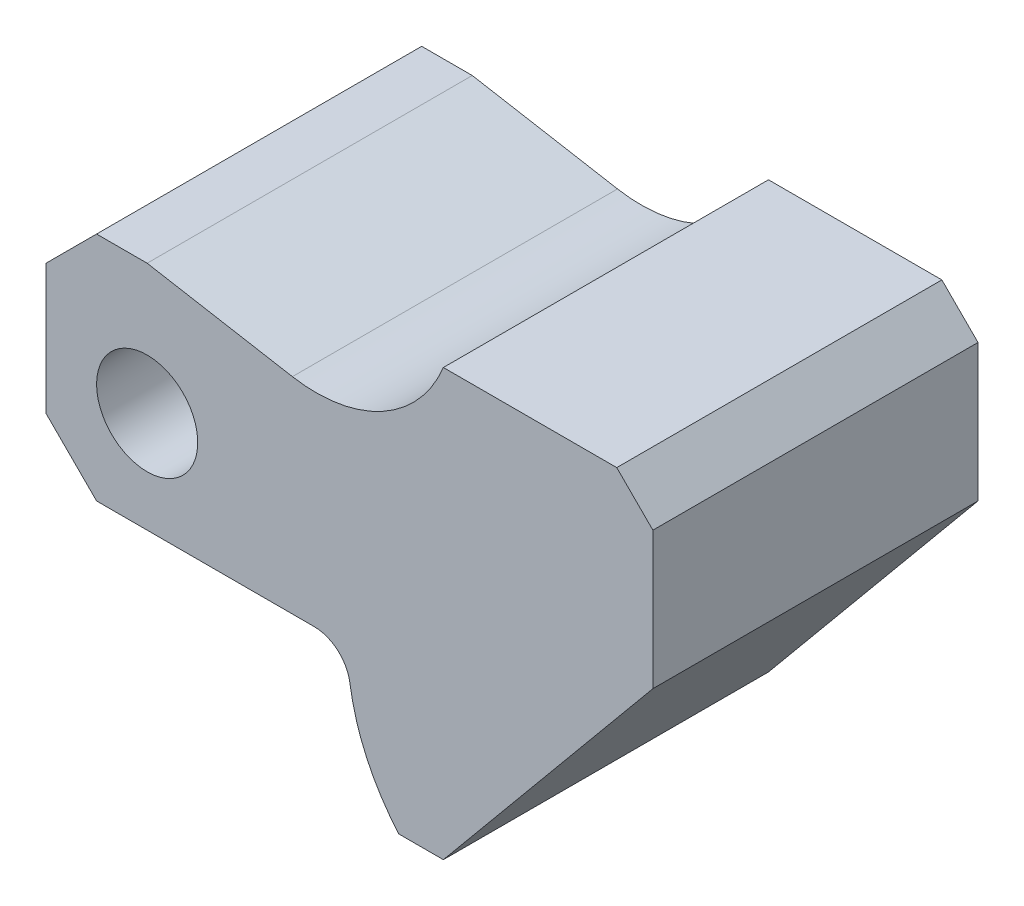
ISO-10303-21;
HEADER;
FILE_DESCRIPTION(('STEP AP214'),'2;1');
FILE_NAME('part.step','',(''),(''),'','','');
FILE_SCHEMA(('AUTOMOTIVE_DESIGN { 1 0 10303 214 1 1 1 1 }'));
ENDSEC;
DATA;
#1=APPLICATION_CONTEXT('core data for automotive mechanical design processes');
#2=APPLICATION_PROTOCOL_DEFINITION('international standard','automotive_design',2000,#1);
#3=PRODUCT_CONTEXT('',#1,'mechanical');
#4=PRODUCT('Part','Part','',(#3));
#5=PRODUCT_RELATED_PRODUCT_CATEGORY('part','',(#4));
#6=PRODUCT_DEFINITION_FORMATION('','',#4);
#7=PRODUCT_DEFINITION_CONTEXT('part definition',#1,'design');
#8=PRODUCT_DEFINITION('design','',#6,#7);
#9=PRODUCT_DEFINITION_SHAPE('','',#8);
#10=(LENGTH_UNIT() NAMED_UNIT(*) SI_UNIT(.MILLI.,.METRE.));
#11=(NAMED_UNIT(*) PLANE_ANGLE_UNIT() SI_UNIT($,.RADIAN.));
#12=(NAMED_UNIT(*) SI_UNIT($,.STERADIAN.) SOLID_ANGLE_UNIT());
#13=UNCERTAINTY_MEASURE_WITH_UNIT(LENGTH_MEASURE(1.E-05),#10,'distance_accuracy_value','');
#14=(GEOMETRIC_REPRESENTATION_CONTEXT(3) GLOBAL_UNCERTAINTY_ASSIGNED_CONTEXT((#13)) GLOBAL_UNIT_ASSIGNED_CONTEXT((#10,
#11,#12)) REPRESENTATION_CONTEXT('',''));
#15=CARTESIAN_POINT('',(0.,0.,0.));
#16=DIRECTION('',(0.,0.,1.));
#17=DIRECTION('',(1.,0.,0.));
#18=AXIS2_PLACEMENT_3D('',#15,#16,#17);
#19=CARTESIAN_POINT('',(37.4033577276849,47.1664622192664,45.));
#20=DIRECTION('',(0.,0.,1.));
#21=DIRECTION('',(1.,0.,0.));
#22=AXIS2_PLACEMENT_3D('',#19,#20,#21);
#23=PLANE('',#22);
#24=DIRECTION('',(-0.984807753012208,0.173648177666931,0.));
#25=VECTOR('',#24,1.);
#26=CARTESIAN_POINT('',(14.,32.,45.));
#27=LINE('',#26,#25);
#28=CARTESIAN_POINT('',(34.1040423520132,28.4551149120344,45.));
#29=VERTEX_POINT('',#28);
#30=CARTESIAN_POINT('',(14.,32.,45.));
#31=VERTEX_POINT('',#30);
#32=EDGE_CURVE('E201',#29,#31,#27,.T.);
#33=ORIENTED_EDGE('',*,*,#32,.T.);
#34=DIRECTION('',(-1.,0.,0.));
#35=VECTOR('',#34,1.);
#36=CARTESIAN_POINT('',(7.,32.,45.));
#37=LINE('',#36,#35);
#38=CARTESIAN_POINT('',(7.,32.,45.));
#39=VERTEX_POINT('',#38);
#40=EDGE_CURVE('E119',#31,#39,#37,.T.);
#41=ORIENTED_EDGE('',*,*,#40,.T.);
#42=DIRECTION('',(-0.707106781186548,-0.707106781186547,0.));
#43=VECTOR('',#42,1.);
#44=CARTESIAN_POINT('',(0.,25.,45.));
#45=LINE('',#44,#43);
#46=CARTESIAN_POINT('',(0.,25.,45.));
#47=VERTEX_POINT('',#46);
#48=EDGE_CURVE('E234',#39,#47,#45,.T.);
#49=ORIENTED_EDGE('',*,*,#48,.T.);
#50=DIRECTION('',(0.,-1.,0.));
#51=VECTOR('',#50,1.);
#52=CARTESIAN_POINT('',(0.,7.,45.));
#53=LINE('',#52,#51);
#54=CARTESIAN_POINT('',(0.,7.,45.));
#55=VERTEX_POINT('',#54);
#56=EDGE_CURVE('E253',#47,#55,#53,.T.);
#57=ORIENTED_EDGE('',*,*,#56,.T.);
#58=DIRECTION('',(0.707106781186547,-0.707106781186547,0.));
#59=VECTOR('',#58,1.);
#60=CARTESIAN_POINT('',(7.,0.,45.));
#61=LINE('',#60,#59);
#62=CARTESIAN_POINT('',(7.,0.,45.));
#63=VERTEX_POINT('',#62);
#64=EDGE_CURVE('E250',#55,#63,#61,.T.);
#65=ORIENTED_EDGE('',*,*,#64,.T.);
#66=DIRECTION('',(1.,0.,0.));
#67=VECTOR('',#66,1.);
#68=CARTESIAN_POINT('',(37.1125137012567,0.,45.));
#69=LINE('',#68,#67);
#70=CARTESIAN_POINT('',(37.1125137012567,0.,45.));
#71=VERTEX_POINT('',#70);
#72=EDGE_CURVE('E252',#63,#71,#69,.T.);
#73=ORIENTED_EDGE('',*,*,#72,.T.);
#74=CARTESIAN_POINT('',(37.1125137012567,-5.,45.));
#75=DIRECTION('',(0.,0.,-1.));
#76=DIRECTION('',(-1.,0.,0.));
#77=AXIS2_PLACEMENT_3D('',#74,#75,#76);
#78=CIRCLE('',#77,5.);
#79=CARTESIAN_POINT('',(42.0581524426685,-4.26470588235294,45.));
#80=VERTEX_POINT('',#79);
#81=EDGE_CURVE('E255',#71,#80,#78,.T.);
#82=ORIENTED_EDGE('',*,*,#81,.T.);
#83=CARTESIAN_POINT('',(70.7428571428571,0.,45.));
#84=DIRECTION('',(0.,0.,1.));
#85=DIRECTION('',(1.,0.,0.));
#86=AXIS2_PLACEMENT_3D('',#83,#84,#85);
#87=CIRCLE('',#86,29.);
#88=CARTESIAN_POINT('',(48.8339548426505,-19.,45.));
#89=VERTEX_POINT('',#88);
#90=EDGE_CURVE('E261',#80,#89,#87,.T.);
#91=ORIENTED_EDGE('',*,*,#90,.T.);
#92=DIRECTION('',(1.,0.,0.));
#93=VECTOR('',#92,1.);
#94=CARTESIAN_POINT('',(55.,-19.,45.));
#95=LINE('',#94,#93);
#96=CARTESIAN_POINT('',(55.,-19.,45.));
#97=VERTEX_POINT('',#96);
#98=EDGE_CURVE('E263',#89,#97,#95,.T.);
#99=ORIENTED_EDGE('',*,*,#98,.T.);
#100=DIRECTION('',(0.638017864750323,0.770021560905562,0.));
#101=VECTOR('',#100,1.);
#102=CARTESIAN_POINT('',(84.,16.,45.));
#103=LINE('',#102,#101);
#104=CARTESIAN_POINT('',(84.,16.,45.));
#105=VERTEX_POINT('',#104);
#106=EDGE_CURVE('E265',#97,#105,#103,.T.);
#107=ORIENTED_EDGE('',*,*,#106,.T.);
#108=DIRECTION('',(0.,1.,0.));
#109=VECTOR('',#108,1.);
#110=CARTESIAN_POINT('',(84.,35.,45.));
#111=LINE('',#110,#109);
#112=CARTESIAN_POINT('',(84.,35.,45.));
#113=VERTEX_POINT('',#112);
#114=EDGE_CURVE('E156',#105,#113,#111,.T.);
#115=ORIENTED_EDGE('',*,*,#114,.T.);
#116=DIRECTION('',(-0.707106781186547,0.707106781186547,0.));
#117=VECTOR('',#116,1.);
#118=CARTESIAN_POINT('',(79.,40.,45.));
#119=LINE('',#118,#117);
#120=CARTESIAN_POINT('',(79.,40.,45.));
#121=VERTEX_POINT('',#120);
#122=EDGE_CURVE('E150',#113,#121,#119,.T.);
#123=ORIENTED_EDGE('',*,*,#122,.T.);
#124=DIRECTION('',(-1.,0.,0.));
#125=VECTOR('',#124,1.);
#126=CARTESIAN_POINT('',(55.,40.,45.));
#127=LINE('',#126,#125);
#128=CARTESIAN_POINT('',(55.,40.,45.));
#129=VERTEX_POINT('',#128);
#130=EDGE_CURVE('E154',#121,#129,#127,.T.);
#131=ORIENTED_EDGE('',*,*,#130,.T.);
#132=CARTESIAN_POINT('',(37.4033577276849,47.1664622192664,45.));
#133=DIRECTION('',(0.,0.,-1.));
#134=DIRECTION('',(1.,0.,0.));
#135=AXIS2_PLACEMENT_3D('',#132,#133,#134);
#136=CIRCLE('',#135,19.);
#137=EDGE_CURVE('E58',#129,#29,#136,.T.);
#138=ORIENTED_EDGE('',*,*,#137,.T.);
#139=EDGE_LOOP('',(#33,#41,#49,#57,#65,#73,#82,#91,#99,#107,#115,#123,#131,#138));
#140=FACE_BOUND('',#139,.T.);
#141=CARTESIAN_POINT('',(14.,14.,45.));
#142=DIRECTION('',(0.,0.,1.));
#143=DIRECTION('',(1.,0.,0.));
#144=AXIS2_PLACEMENT_3D('',#141,#142,#143);
#145=CIRCLE('',#144,7.);
#146=CARTESIAN_POINT('',(7.,14.,45.));
#147=VERTEX_POINT('',#146);
#148=EDGE_CURVE('E178',#147,#147,#145,.T.);
#149=ORIENTED_EDGE('',*,*,#148,.F.);
#150=EDGE_LOOP('',(#149));
#151=FACE_BOUND('',#150,.T.);
#152=ADVANCED_FACE('F41',(#140,#151),#23,.T.);
#153=CARTESIAN_POINT('',(37.4033577276849,47.1664622192664,0.));
#154=DIRECTION('',(0.,0.,1.));
#155=DIRECTION('',(1.,0.,0.));
#156=AXIS2_PLACEMENT_3D('',#153,#154,#155);
#157=PLANE('',#156);
#158=DIRECTION('',(-0.984807753012208,0.173648177666931,0.));
#159=VECTOR('',#158,1.);
#160=CARTESIAN_POINT('',(14.,32.,0.));
#161=LINE('',#160,#159);
#162=CARTESIAN_POINT('',(34.1040423520132,28.4551149120344,0.));
#163=VERTEX_POINT('',#162);
#164=CARTESIAN_POINT('',(14.,32.,0.));
#165=VERTEX_POINT('',#164);
#166=EDGE_CURVE('E174',#163,#165,#161,.T.);
#167=ORIENTED_EDGE('',*,*,#166,.F.);
#168=CARTESIAN_POINT('',(37.4033577276849,47.1664622192664,0.));
#169=DIRECTION('',(0.,0.,-1.));
#170=DIRECTION('',(1.,0.,0.));
#171=AXIS2_PLACEMENT_3D('',#168,#169,#170);
#172=CIRCLE('',#171,19.);
#173=CARTESIAN_POINT('',(55.,40.,0.));
#174=VERTEX_POINT('',#173);
#175=EDGE_CURVE('E111',#174,#163,#172,.T.);
#176=ORIENTED_EDGE('',*,*,#175,.F.);
#177=DIRECTION('',(-1.,0.,0.));
#178=VECTOR('',#177,1.);
#179=CARTESIAN_POINT('',(55.,40.,0.));
#180=LINE('',#179,#178);
#181=CARTESIAN_POINT('',(79.,40.,0.));
#182=VERTEX_POINT('',#181);
#183=EDGE_CURVE('E105',#182,#174,#180,.T.);
#184=ORIENTED_EDGE('',*,*,#183,.F.);
#185=DIRECTION('',(-0.707106781186547,0.707106781186547,0.));
#186=VECTOR('',#185,1.);
#187=CARTESIAN_POINT('',(79.,40.,0.));
#188=LINE('',#187,#186);
#189=CARTESIAN_POINT('',(84.,35.,0.));
#190=VERTEX_POINT('',#189);
#191=EDGE_CURVE('E164',#190,#182,#188,.T.);
#192=ORIENTED_EDGE('',*,*,#191,.F.);
#193=DIRECTION('',(0.,1.,0.));
#194=VECTOR('',#193,1.);
#195=CARTESIAN_POINT('',(84.,35.,0.));
#196=LINE('',#195,#194);
#197=CARTESIAN_POINT('',(84.,16.,0.));
#198=VERTEX_POINT('',#197);
#199=EDGE_CURVE('E196',#198,#190,#196,.T.);
#200=ORIENTED_EDGE('',*,*,#199,.F.);
#201=DIRECTION('',(0.638017864750323,0.770021560905562,0.));
#202=VECTOR('',#201,1.);
#203=CARTESIAN_POINT('',(84.,16.,0.));
#204=LINE('',#203,#202);
#205=CARTESIAN_POINT('',(55.,-19.,0.));
#206=VERTEX_POINT('',#205);
#207=EDGE_CURVE('E194',#206,#198,#204,.T.);
#208=ORIENTED_EDGE('',*,*,#207,.F.);
#209=DIRECTION('',(1.,0.,0.));
#210=VECTOR('',#209,1.);
#211=CARTESIAN_POINT('',(55.,-19.,0.));
#212=LINE('',#211,#210);
#213=CARTESIAN_POINT('',(48.8339548426505,-19.,0.));
#214=VERTEX_POINT('',#213);
#215=EDGE_CURVE('E192',#214,#206,#212,.T.);
#216=ORIENTED_EDGE('',*,*,#215,.F.);
#217=CARTESIAN_POINT('',(70.7428571428571,0.,0.));
#218=DIRECTION('',(0.,0.,1.));
#219=DIRECTION('',(1.,0.,0.));
#220=AXIS2_PLACEMENT_3D('',#217,#218,#219);
#221=CIRCLE('',#220,29.);
#222=CARTESIAN_POINT('',(42.0581524426685,-4.26470588235294,0.));
#223=VERTEX_POINT('',#222);
#224=EDGE_CURVE('E190',#223,#214,#221,.T.);
#225=ORIENTED_EDGE('',*,*,#224,.F.);
#226=CARTESIAN_POINT('',(37.1125137012567,-5.,0.));
#227=DIRECTION('',(0.,0.,-1.));
#228=DIRECTION('',(-1.,0.,0.));
#229=AXIS2_PLACEMENT_3D('',#226,#227,#228);
#230=CIRCLE('',#229,5.);
#231=CARTESIAN_POINT('',(37.1125137012567,0.,0.));
#232=VERTEX_POINT('',#231);
#233=EDGE_CURVE('E188',#232,#223,#230,.T.);
#234=ORIENTED_EDGE('',*,*,#233,.F.);
#235=DIRECTION('',(1.,0.,0.));
#236=VECTOR('',#235,1.);
#237=CARTESIAN_POINT('',(37.1125137012567,0.,0.));
#238=LINE('',#237,#236);
#239=CARTESIAN_POINT('',(7.,0.,0.));
#240=VERTEX_POINT('',#239);
#241=EDGE_CURVE('E186',#240,#232,#238,.T.);
#242=ORIENTED_EDGE('',*,*,#241,.F.);
#243=DIRECTION('',(0.707106781186547,-0.707106781186547,0.));
#244=VECTOR('',#243,1.);
#245=CARTESIAN_POINT('',(7.,0.,0.));
#246=LINE('',#245,#244);
#247=CARTESIAN_POINT('',(0.,7.,0.));
#248=VERTEX_POINT('',#247);
#249=EDGE_CURVE('E184',#248,#240,#246,.T.);
#250=ORIENTED_EDGE('',*,*,#249,.F.);
#251=DIRECTION('',(0.,-1.,0.));
#252=VECTOR('',#251,1.);
#253=CARTESIAN_POINT('',(0.,7.,0.));
#254=LINE('',#253,#252);
#255=CARTESIAN_POINT('',(0.,25.,0.));
#256=VERTEX_POINT('',#255);
#257=EDGE_CURVE('E182',#256,#248,#254,.T.);
#258=ORIENTED_EDGE('',*,*,#257,.F.);
#259=DIRECTION('',(-0.707106781186548,-0.707106781186547,0.));
#260=VECTOR('',#259,1.);
#261=CARTESIAN_POINT('',(0.,25.,0.));
#262=LINE('',#261,#260);
#263=CARTESIAN_POINT('',(7.,32.,0.));
#264=VERTEX_POINT('',#263);
#265=EDGE_CURVE('E180',#264,#256,#262,.T.);
#266=ORIENTED_EDGE('',*,*,#265,.F.);
#267=DIRECTION('',(-1.,0.,0.));
#268=VECTOR('',#267,1.);
#269=CARTESIAN_POINT('',(7.,32.,0.));
#270=LINE('',#269,#268);
#271=EDGE_CURVE('E177',#165,#264,#270,.T.);
#272=ORIENTED_EDGE('',*,*,#271,.F.);
#273=EDGE_LOOP('',(#167,#176,#184,#192,#200,#208,#216,#225,#234,#242,#250,#258,#266,#272));
#274=FACE_BOUND('',#273,.T.);
#275=CARTESIAN_POINT('',(14.,14.,0.));
#276=DIRECTION('',(0.,0.,1.));
#277=DIRECTION('',(1.,0.,0.));
#278=AXIS2_PLACEMENT_3D('',#275,#276,#277);
#279=CIRCLE('',#278,7.);
#280=CARTESIAN_POINT('',(7.,14.,0.));
#281=VERTEX_POINT('',#280);
#282=EDGE_CURVE('E506',#281,#281,#279,.T.);
#283=ORIENTED_EDGE('',*,*,#282,.T.);
#284=EDGE_LOOP('',(#283));
#285=FACE_BOUND('',#284,.T.);
#286=ADVANCED_FACE('F238',(#274,#285),#157,.F.);
#287=CARTESIAN_POINT('',(14.,32.,45.));
#288=DIRECTION('',(-0.173648177666931,-0.984807753012208,0.));
#289=DIRECTION('',(0.984807753012208,-0.173648177666931,0.));
#290=AXIS2_PLACEMENT_3D('',#287,#288,#289);
#291=PLANE('',#290);
#292=ORIENTED_EDGE('',*,*,#166,.T.);
#293=DIRECTION('',(0.,0.,-1.));
#294=VECTOR('',#293,1.);
#295=CARTESIAN_POINT('',(14.,32.,45.));
#296=LINE('',#295,#294);
#297=EDGE_CURVE('E11',#31,#165,#296,.T.);
#298=ORIENTED_EDGE('',*,*,#297,.F.);
#299=ORIENTED_EDGE('',*,*,#32,.F.);
#300=DIRECTION('',(0.,0.,-1.));
#301=VECTOR('',#300,1.);
#302=CARTESIAN_POINT('',(34.1040423520132,28.4551149120344,45.));
#303=LINE('',#302,#301);
#304=EDGE_CURVE('E170',#29,#163,#303,.T.);
#305=ORIENTED_EDGE('',*,*,#304,.T.);
#306=EDGE_LOOP('',(#292,#298,#299,#305));
#307=FACE_BOUND('',#306,.T.);
#308=ADVANCED_FACE('F43',(#307),#291,.F.);
#309=CARTESIAN_POINT('',(7.,32.,45.));
#310=DIRECTION('',(0.,-1.,0.));
#311=DIRECTION('',(0.,0.,-1.));
#312=AXIS2_PLACEMENT_3D('',#309,#310,#311);
#313=PLANE('',#312);
#314=ORIENTED_EDGE('',*,*,#271,.T.);
#315=DIRECTION('',(0.,0.,-1.));
#316=VECTOR('',#315,1.);
#317=CARTESIAN_POINT('',(7.,32.,45.));
#318=LINE('',#317,#316);
#319=EDGE_CURVE('E50',#39,#264,#318,.T.);
#320=ORIENTED_EDGE('',*,*,#319,.F.);
#321=ORIENTED_EDGE('',*,*,#40,.F.);
#322=ORIENTED_EDGE('',*,*,#297,.T.);
#323=EDGE_LOOP('',(#314,#320,#321,#322));
#324=FACE_BOUND('',#323,.T.);
#325=ADVANCED_FACE('F299',(#324),#313,.F.);
#326=CARTESIAN_POINT('',(0.,25.,45.));
#327=DIRECTION('',(0.707106781186547,-0.707106781186547,0.));
#328=DIRECTION('',(0.707106781186548,0.707106781186548,0.));
#329=AXIS2_PLACEMENT_3D('',#326,#327,#328);
#330=PLANE('',#329);
#331=ORIENTED_EDGE('',*,*,#265,.T.);
#332=DIRECTION('',(0.,0.,-1.));
#333=VECTOR('',#332,1.);
#334=CARTESIAN_POINT('',(0.,25.,45.));
#335=LINE('',#334,#333);
#336=EDGE_CURVE('E226',#47,#256,#335,.T.);
#337=ORIENTED_EDGE('',*,*,#336,.F.);
#338=ORIENTED_EDGE('',*,*,#48,.F.);
#339=ORIENTED_EDGE('',*,*,#319,.T.);
#340=EDGE_LOOP('',(#331,#337,#338,#339));
#341=FACE_BOUND('',#340,.T.);
#342=ADVANCED_FACE('F232',(#341),#330,.F.);
#343=CARTESIAN_POINT('',(0.,7.,45.));
#344=DIRECTION('',(1.,0.,0.));
#345=DIRECTION('',(0.,0.,-1.));
#346=AXIS2_PLACEMENT_3D('',#343,#344,#345);
#347=PLANE('',#346);
#348=ORIENTED_EDGE('',*,*,#257,.T.);
#349=DIRECTION('',(0.,0.,-1.));
#350=VECTOR('',#349,1.);
#351=CARTESIAN_POINT('',(0.,7.,45.));
#352=LINE('',#351,#350);
#353=EDGE_CURVE('E223',#55,#248,#352,.T.);
#354=ORIENTED_EDGE('',*,*,#353,.F.);
#355=ORIENTED_EDGE('',*,*,#56,.F.);
#356=ORIENTED_EDGE('',*,*,#336,.T.);
#357=EDGE_LOOP('',(#348,#354,#355,#356));
#358=FACE_BOUND('',#357,.T.);
#359=ADVANCED_FACE('F244',(#358),#347,.F.);
#360=CARTESIAN_POINT('',(7.,0.,45.));
#361=DIRECTION('',(0.707106781186547,0.707106781186547,0.));
#362=DIRECTION('',(-0.707106781186548,0.707106781186548,0.));
#363=AXIS2_PLACEMENT_3D('',#360,#361,#362);
#364=PLANE('',#363);
#365=ORIENTED_EDGE('',*,*,#249,.T.);
#366=DIRECTION('',(0.,0.,-1.));
#367=VECTOR('',#366,1.);
#368=CARTESIAN_POINT('',(7.,0.,45.));
#369=LINE('',#368,#367);
#370=EDGE_CURVE('E220',#63,#240,#369,.T.);
#371=ORIENTED_EDGE('',*,*,#370,.F.);
#372=ORIENTED_EDGE('',*,*,#64,.F.);
#373=ORIENTED_EDGE('',*,*,#353,.T.);
#374=EDGE_LOOP('',(#365,#371,#372,#373));
#375=FACE_BOUND('',#374,.T.);
#376=ADVANCED_FACE('F248',(#375),#364,.F.);
#377=CARTESIAN_POINT('',(37.1125137012567,0.,45.));
#378=DIRECTION('',(0.,1.,0.));
#379=DIRECTION('',(0.,0.,1.));
#380=AXIS2_PLACEMENT_3D('',#377,#378,#379);
#381=PLANE('',#380);
#382=ORIENTED_EDGE('',*,*,#241,.T.);
#383=DIRECTION('',(0.,0.,-1.));
#384=VECTOR('',#383,1.);
#385=CARTESIAN_POINT('',(37.1125137012567,0.,45.));
#386=LINE('',#385,#384);
#387=EDGE_CURVE('E217',#71,#232,#386,.T.);
#388=ORIENTED_EDGE('',*,*,#387,.F.);
#389=ORIENTED_EDGE('',*,*,#72,.F.);
#390=ORIENTED_EDGE('',*,*,#370,.T.);
#391=EDGE_LOOP('',(#382,#388,#389,#390));
#392=FACE_BOUND('',#391,.T.);
#393=ADVANCED_FACE('F312',(#392),#381,.F.);
#394=CARTESIAN_POINT('',(37.1125137012567,-5.,45.));
#395=DIRECTION('',(0.,0.,-1.));
#396=DIRECTION('',(-1.,0.,0.));
#397=AXIS2_PLACEMENT_3D('',#394,#395,#396);
#398=CYLINDRICAL_SURFACE('',#397,5.);
#399=ORIENTED_EDGE('',*,*,#233,.T.);
#400=DIRECTION('',(0.,0.,-1.));
#401=VECTOR('',#400,1.);
#402=CARTESIAN_POINT('',(42.0581524426685,-4.26470588235294,45.));
#403=LINE('',#402,#401);
#404=EDGE_CURVE('E214',#80,#223,#403,.T.);
#405=ORIENTED_EDGE('',*,*,#404,.F.);
#406=ORIENTED_EDGE('',*,*,#81,.F.);
#407=ORIENTED_EDGE('',*,*,#387,.T.);
#408=EDGE_LOOP('',(#399,#405,#406,#407));
#409=FACE_BOUND('',#408,.T.);
#410=ADVANCED_FACE('F315',(#409),#398,.F.);
#411=CARTESIAN_POINT('',(70.7428571428571,0.,45.));
#412=DIRECTION('',(0.,0.,-1.));
#413=DIRECTION('',(-1.,0.,0.));
#414=AXIS2_PLACEMENT_3D('',#411,#412,#413);
#415=CYLINDRICAL_SURFACE('',#414,29.);
#416=ORIENTED_EDGE('',*,*,#224,.T.);
#417=DIRECTION('',(0.,0.,-1.));
#418=VECTOR('',#417,1.);
#419=CARTESIAN_POINT('',(48.8339548426505,-19.,45.));
#420=LINE('',#419,#418);
#421=EDGE_CURVE('E211',#89,#214,#420,.T.);
#422=ORIENTED_EDGE('',*,*,#421,.F.);
#423=ORIENTED_EDGE('',*,*,#90,.F.);
#424=ORIENTED_EDGE('',*,*,#404,.T.);
#425=EDGE_LOOP('',(#416,#422,#423,#424));
#426=FACE_BOUND('',#425,.T.);
#427=ADVANCED_FACE('F319',(#426),#415,.T.);
#428=CARTESIAN_POINT('',(55.,-19.,45.));
#429=DIRECTION('',(0.,1.,0.));
#430=DIRECTION('',(-1.,0.,0.));
#431=AXIS2_PLACEMENT_3D('',#428,#429,#430);
#432=PLANE('',#431);
#433=ORIENTED_EDGE('',*,*,#215,.T.);
#434=DIRECTION('',(0.,0.,-1.));
#435=VECTOR('',#434,1.);
#436=CARTESIAN_POINT('',(55.,-19.,45.));
#437=LINE('',#436,#435);
#438=EDGE_CURVE('E208',#97,#206,#437,.T.);
#439=ORIENTED_EDGE('',*,*,#438,.F.);
#440=ORIENTED_EDGE('',*,*,#98,.F.);
#441=ORIENTED_EDGE('',*,*,#421,.T.);
#442=EDGE_LOOP('',(#433,#439,#440,#441));
#443=FACE_BOUND('',#442,.T.);
#444=ADVANCED_FACE('F323',(#443),#432,.F.);
#445=CARTESIAN_POINT('',(84.,16.,45.));
#446=DIRECTION('',(-0.770021560905562,0.638017864750323,0.));
#447=DIRECTION('',(-0.638017864750323,-0.770021560905562,0.));
#448=AXIS2_PLACEMENT_3D('',#445,#446,#447);
#449=PLANE('',#448);
#450=ORIENTED_EDGE('',*,*,#207,.T.);
#451=DIRECTION('',(0.,0.,-1.));
#452=VECTOR('',#451,1.);
#453=CARTESIAN_POINT('',(84.,16.,45.));
#454=LINE('',#453,#452);
#455=EDGE_CURVE('E205',#105,#198,#454,.T.);
#456=ORIENTED_EDGE('',*,*,#455,.F.);
#457=ORIENTED_EDGE('',*,*,#106,.F.);
#458=ORIENTED_EDGE('',*,*,#438,.T.);
#459=EDGE_LOOP('',(#450,#456,#457,#458));
#460=FACE_BOUND('',#459,.T.);
#461=ADVANCED_FACE('F271',(#460),#449,.F.);
#462=CARTESIAN_POINT('',(84.,35.,45.));
#463=DIRECTION('',(-1.,0.,0.));
#464=DIRECTION('',(0.,0.,1.));
#465=AXIS2_PLACEMENT_3D('',#462,#463,#464);
#466=PLANE('',#465);
#467=ORIENTED_EDGE('',*,*,#199,.T.);
#468=DIRECTION('',(0.,0.,-1.));
#469=VECTOR('',#468,1.);
#470=CARTESIAN_POINT('',(84.,35.,45.));
#471=LINE('',#470,#469);
#472=EDGE_CURVE('E165',#113,#190,#471,.T.);
#473=ORIENTED_EDGE('',*,*,#472,.F.);
#474=ORIENTED_EDGE('',*,*,#114,.F.);
#475=ORIENTED_EDGE('',*,*,#455,.T.);
#476=EDGE_LOOP('',(#467,#473,#474,#475));
#477=FACE_BOUND('',#476,.T.);
#478=ADVANCED_FACE('F275',(#477),#466,.F.);
#479=CARTESIAN_POINT('',(79.,40.,45.));
#480=DIRECTION('',(-0.707106781186547,-0.707106781186547,0.));
#481=DIRECTION('',(0.707106781186548,-0.707106781186548,0.));
#482=AXIS2_PLACEMENT_3D('',#479,#480,#481);
#483=PLANE('',#482);
#484=ORIENTED_EDGE('',*,*,#191,.T.);
#485=DIRECTION('',(0.,0.,-1.));
#486=VECTOR('',#485,1.);
#487=CARTESIAN_POINT('',(79.,40.,45.));
#488=LINE('',#487,#486);
#489=EDGE_CURVE('E161',#121,#182,#488,.T.);
#490=ORIENTED_EDGE('',*,*,#489,.F.);
#491=ORIENTED_EDGE('',*,*,#122,.F.);
#492=ORIENTED_EDGE('',*,*,#472,.T.);
#493=EDGE_LOOP('',(#484,#490,#491,#492));
#494=FACE_BOUND('',#493,.T.);
#495=ADVANCED_FACE('F162',(#494),#483,.F.);
#496=CARTESIAN_POINT('',(55.,40.,45.));
#497=DIRECTION('',(0.,-1.,0.));
#498=DIRECTION('',(1.,0.,0.));
#499=AXIS2_PLACEMENT_3D('',#496,#497,#498);
#500=PLANE('',#499);
#501=ORIENTED_EDGE('',*,*,#183,.T.);
#502=DIRECTION('',(0.,0.,-1.));
#503=VECTOR('',#502,1.);
#504=CARTESIAN_POINT('',(55.,40.,45.));
#505=LINE('',#504,#503);
#506=EDGE_CURVE('E166',#129,#174,#505,.T.);
#507=ORIENTED_EDGE('',*,*,#506,.F.);
#508=ORIENTED_EDGE('',*,*,#130,.F.);
#509=ORIENTED_EDGE('',*,*,#489,.T.);
#510=EDGE_LOOP('',(#501,#507,#508,#509));
#511=FACE_BOUND('',#510,.T.);
#512=ADVANCED_FACE('F168',(#511),#500,.F.);
#513=CARTESIAN_POINT('',(37.4033577276849,47.1664622192664,45.));
#514=DIRECTION('',(0.,0.,-1.));
#515=DIRECTION('',(-1.,0.,0.));
#516=AXIS2_PLACEMENT_3D('',#513,#514,#515);
#517=CYLINDRICAL_SURFACE('',#516,19.);
#518=ORIENTED_EDGE('',*,*,#175,.T.);
#519=ORIENTED_EDGE('',*,*,#304,.F.);
#520=ORIENTED_EDGE('',*,*,#137,.F.);
#521=ORIENTED_EDGE('',*,*,#506,.T.);
#522=EDGE_LOOP('',(#518,#519,#520,#521));
#523=FACE_BOUND('',#522,.T.);
#524=ADVANCED_FACE('F279',(#523),#517,.F.);
#525=CARTESIAN_POINT('',(14.,14.,45.));
#526=DIRECTION('',(0.,0.,-1.));
#527=DIRECTION('',(-1.,0.,0.));
#528=AXIS2_PLACEMENT_3D('',#525,#526,#527);
#529=CYLINDRICAL_SURFACE('',#528,7.);
#530=CARTESIAN_POINT('',(7.,14.,45.));
#531=CARTESIAN_POINT('',(7.,14.,44.53125));
#532=CARTESIAN_POINT('',(7.,14.,44.0625));
#533=CARTESIAN_POINT('',(7.,14.,43.125));
#534=CARTESIAN_POINT('',(7.,14.,42.65625));
#535=CARTESIAN_POINT('',(7.,14.,41.71875));
#536=CARTESIAN_POINT('',(7.,14.,41.25));
#537=CARTESIAN_POINT('',(7.,14.,40.3125));
#538=CARTESIAN_POINT('',(7.,14.,39.84375));
#539=CARTESIAN_POINT('',(7.,14.,38.90625));
#540=CARTESIAN_POINT('',(7.,14.,38.4375));
#541=CARTESIAN_POINT('',(7.,14.,37.5));
#542=CARTESIAN_POINT('',(7.,14.,37.03125));
#543=CARTESIAN_POINT('',(7.,14.,36.09375));
#544=CARTESIAN_POINT('',(7.,14.,35.625));
#545=CARTESIAN_POINT('',(7.,14.,34.6875));
#546=CARTESIAN_POINT('',(7.,14.,34.21875));
#547=CARTESIAN_POINT('',(7.,14.,33.28125));
#548=CARTESIAN_POINT('',(7.,14.,32.8125));
#549=CARTESIAN_POINT('',(7.,14.,31.875));
#550=CARTESIAN_POINT('',(7.,14.,31.40625));
#551=CARTESIAN_POINT('',(7.,14.,30.46875));
#552=CARTESIAN_POINT('',(7.,14.,30.));
#553=CARTESIAN_POINT('',(7.,14.,29.0625));
#554=CARTESIAN_POINT('',(7.,14.,28.59375));
#555=CARTESIAN_POINT('',(7.,14.,27.65625));
#556=CARTESIAN_POINT('',(7.,14.,27.1875));
#557=CARTESIAN_POINT('',(7.,14.,26.25));
#558=CARTESIAN_POINT('',(7.,14.,25.78125));
#559=CARTESIAN_POINT('',(7.,14.,24.84375));
#560=CARTESIAN_POINT('',(7.,14.,24.375));
#561=CARTESIAN_POINT('',(7.,14.,23.4375));
#562=CARTESIAN_POINT('',(7.,14.,22.96875));
#563=CARTESIAN_POINT('',(7.,14.,22.03125));
#564=CARTESIAN_POINT('',(7.,14.,21.5625));
#565=CARTESIAN_POINT('',(7.,14.,20.625));
#566=CARTESIAN_POINT('',(7.,14.,20.15625));
#567=CARTESIAN_POINT('',(7.,14.,19.21875));
#568=CARTESIAN_POINT('',(7.,14.,18.75));
#569=CARTESIAN_POINT('',(7.,14.,17.8125));
#570=CARTESIAN_POINT('',(7.,14.,17.34375));
#571=CARTESIAN_POINT('',(7.,14.,16.40625));
#572=CARTESIAN_POINT('',(7.,14.,15.9375));
#573=CARTESIAN_POINT('',(7.,14.,15.));
#574=CARTESIAN_POINT('',(7.,14.,14.53125));
#575=CARTESIAN_POINT('',(7.,14.,13.59375));
#576=CARTESIAN_POINT('',(7.,14.,13.125));
#577=CARTESIAN_POINT('',(7.,14.,12.1875));
#578=CARTESIAN_POINT('',(7.,14.,11.71875));
#579=CARTESIAN_POINT('',(7.,14.,10.78125));
#580=CARTESIAN_POINT('',(7.,14.,10.3125));
#581=CARTESIAN_POINT('',(7.,14.,9.375));
#582=CARTESIAN_POINT('',(7.,14.,8.90625));
#583=CARTESIAN_POINT('',(7.,14.,7.96874999999999));
#584=CARTESIAN_POINT('',(7.,14.,7.5));
#585=CARTESIAN_POINT('',(7.,14.,6.5625));
#586=CARTESIAN_POINT('',(7.,14.,6.09375));
#587=CARTESIAN_POINT('',(7.,14.,5.15625));
#588=CARTESIAN_POINT('',(7.,14.,4.68749999999999));
#589=CARTESIAN_POINT('',(7.,14.,3.74999999999999));
#590=CARTESIAN_POINT('',(7.,14.,3.28124999999999));
#591=CARTESIAN_POINT('',(7.,14.,2.34374999999999));
#592=CARTESIAN_POINT('',(7.,14.,1.87499999999999));
#593=CARTESIAN_POINT('',(7.,14.,0.937499999999992));
#594=CARTESIAN_POINT('',(7.,14.,0.468749999999993));
#595=CARTESIAN_POINT('',(7.,14.,0.));
#596=B_SPLINE_CURVE_WITH_KNOTS('',3,(#530,#531,#532,#533,#534,#535,#536,#537,#538,#539,#540,
#541,#542,#543,#544,#545,#546,#547,#548,#549,#550,#551,#552,#553,#554,#555,#556,#557,#558,#559,
#560,#561,#562,#563,#564,#565,#566,#567,#568,#569,#570,#571,#572,#573,#574,#575,#576,#577,#578,
#579,#580,#581,#582,#583,#584,#585,#586,#587,#588,#589,#590,#591,#592,#593,#594,#595),
.UNSPECIFIED.,.F.,.F.,(4,2,2,2,2,2,2,2,2,2,2,2,2,2,2,2,2,2,2,2,2,2,2,2,2,2,2,2,2,2,2,2,4),(0.,
1.40625,2.8125,4.21875000000001,5.62500000000001,7.03125,8.4375,9.84375000000001,11.25,12.65625,
14.0625,15.46875,16.875,18.28125,19.6875,21.09375,22.5,23.90625,25.3125,26.71875,28.125,
29.53125,30.9375,32.34375,33.75,35.15625,36.5625,37.96875,39.375,40.78125,42.1875,43.59375,45.),.UNSPECIFIED.);
#597=EDGE_CURVE('BSEAM281',#147,#281,#596,.T.);
#598=ORIENTED_EDGE('',*,*,#148,.T.);
#599=ORIENTED_EDGE('',*,*,#282,.F.);
#600=ORIENTED_EDGE('',*,*,#597,.T.);
#601=ORIENTED_EDGE('',*,*,#597,.F.);
#602=EDGE_LOOP('',(#598,#600,#599,#601));
#603=FACE_BOUND('',#602,.T.);
#604=ADVANCED_FACE('F281',(#603),#529,.F.);
#605=CLOSED_SHELL('',(#152,#286,#308,#325,#342,#359,#376,#393,#410,#427,#444,#461,#478,#495,
#512,#524,#604));
#606=MANIFOLD_SOLID_BREP('B2',#605);
#607=ADVANCED_BREP_SHAPE_REPRESENTATION('',(#18,#606),#14);
#608=SHAPE_DEFINITION_REPRESENTATION(#9,#607);
ENDSEC;
END-ISO-10303-21;
